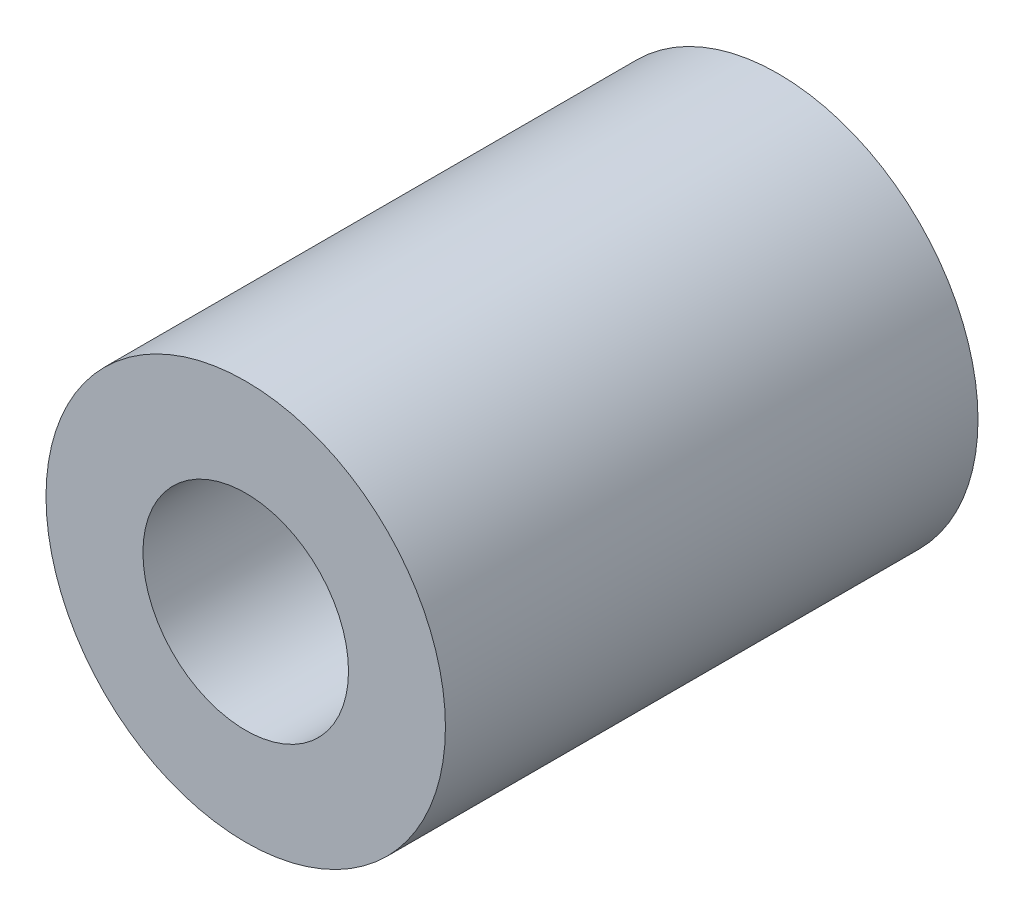
ISO-10303-21;
HEADER;
FILE_DESCRIPTION(('STEP AP214'),'2;1');
FILE_NAME('part.step','',(''),(''),'','','');
FILE_SCHEMA(('AUTOMOTIVE_DESIGN { 1 0 10303 214 1 1 1 1 }'));
ENDSEC;
DATA;
#1=APPLICATION_CONTEXT('core data for automotive mechanical design processes');
#2=APPLICATION_PROTOCOL_DEFINITION('international standard','automotive_design',2000,#1);
#3=PRODUCT_CONTEXT('',#1,'mechanical');
#4=PRODUCT('Part','Part','',(#3));
#5=PRODUCT_RELATED_PRODUCT_CATEGORY('part','',(#4));
#6=PRODUCT_DEFINITION_FORMATION('','',#4);
#7=PRODUCT_DEFINITION_CONTEXT('part definition',#1,'design');
#8=PRODUCT_DEFINITION('design','',#6,#7);
#9=PRODUCT_DEFINITION_SHAPE('','',#8);
#10=(LENGTH_UNIT() NAMED_UNIT(*) SI_UNIT(.MILLI.,.METRE.));
#11=(NAMED_UNIT(*) PLANE_ANGLE_UNIT() SI_UNIT($,.RADIAN.));
#12=(NAMED_UNIT(*) SI_UNIT($,.STERADIAN.) SOLID_ANGLE_UNIT());
#13=UNCERTAINTY_MEASURE_WITH_UNIT(LENGTH_MEASURE(1.E-05),#10,'distance_accuracy_value','');
#14=(GEOMETRIC_REPRESENTATION_CONTEXT(3) GLOBAL_UNCERTAINTY_ASSIGNED_CONTEXT((#13)) GLOBAL_UNIT_ASSIGNED_CONTEXT((#10,
#11,#12)) REPRESENTATION_CONTEXT('',''));
#15=CARTESIAN_POINT('',(0.,0.,0.));
#16=DIRECTION('',(0.,0.,1.));
#17=DIRECTION('',(1.,0.,0.));
#18=AXIS2_PLACEMENT_3D('',#15,#16,#17);
#19=CARTESIAN_POINT('',(0.,0.,12.7));
#20=DIRECTION('',(0.,0.,1.));
#21=DIRECTION('',(1.,0.,0.));
#22=AXIS2_PLACEMENT_3D('',#19,#20,#21);
#23=PLANE('',#22);
#24=CARTESIAN_POINT('',(0.,0.,12.7));
#25=DIRECTION('',(0.,0.,1.));
#26=DIRECTION('',(1.,0.,0.));
#27=AXIS2_PLACEMENT_3D('',#24,#25,#26);
#28=CIRCLE('',#27,4.7625);
#29=CARTESIAN_POINT('',(4.7625,0.,12.7));
#30=VERTEX_POINT('',#29);
#31=EDGE_CURVE('E10',#30,#30,#28,.T.);
#32=ORIENTED_EDGE('',*,*,#31,.T.);
#33=EDGE_LOOP('',(#32));
#34=FACE_BOUND('',#33,.T.);
#35=CARTESIAN_POINT('',(0.,0.,12.7));
#36=DIRECTION('',(0.,0.,1.));
#37=DIRECTION('',(1.,0.,0.));
#38=AXIS2_PLACEMENT_3D('',#35,#36,#37);
#39=CIRCLE('',#38,2.4511);
#40=CARTESIAN_POINT('',(2.4511,0.,12.7));
#41=VERTEX_POINT('',#40);
#42=EDGE_CURVE('E56',#41,#41,#39,.T.);
#43=ORIENTED_EDGE('',*,*,#42,.F.);
#44=EDGE_LOOP('',(#43));
#45=FACE_BOUND('',#44,.T.);
#46=ADVANCED_FACE('F43',(#34,#45),#23,.T.);
#47=CARTESIAN_POINT('',(0.,0.,0.));
#48=DIRECTION('',(0.,0.,1.));
#49=DIRECTION('',(1.,0.,0.));
#50=AXIS2_PLACEMENT_3D('',#47,#48,#49);
#51=PLANE('',#50);
#52=CARTESIAN_POINT('',(0.,0.,0.));
#53=DIRECTION('',(0.,0.,1.));
#54=DIRECTION('',(1.,0.,0.));
#55=AXIS2_PLACEMENT_3D('',#52,#53,#54);
#56=CIRCLE('',#55,4.7625);
#57=CARTESIAN_POINT('',(4.7625,0.,0.));
#58=VERTEX_POINT('',#57);
#59=EDGE_CURVE('E47',#58,#58,#56,.T.);
#60=ORIENTED_EDGE('',*,*,#59,.F.);
#61=EDGE_LOOP('',(#60));
#62=FACE_BOUND('',#61,.T.);
#63=CARTESIAN_POINT('',(0.,0.,0.));
#64=DIRECTION('',(0.,0.,1.));
#65=DIRECTION('',(1.,0.,0.));
#66=AXIS2_PLACEMENT_3D('',#63,#64,#65);
#67=CIRCLE('',#66,2.4511);
#68=CARTESIAN_POINT('',(2.4511,0.,0.));
#69=VERTEX_POINT('',#68);
#70=EDGE_CURVE('E58',#69,#69,#67,.T.);
#71=ORIENTED_EDGE('',*,*,#70,.T.);
#72=EDGE_LOOP('',(#71));
#73=FACE_BOUND('',#72,.T.);
#74=ADVANCED_FACE('F70',(#62,#73),#51,.F.);
#75=CARTESIAN_POINT('',(0.,0.,12.7));
#76=DIRECTION('',(0.,0.,-1.));
#77=DIRECTION('',(-1.,0.,0.));
#78=AXIS2_PLACEMENT_3D('',#75,#76,#77);
#79=CYLINDRICAL_SURFACE('',#78,4.7625);
#80=ORIENTED_EDGE('',*,*,#31,.F.);
#81=EDGE_LOOP('',(#80));
#82=FACE_BOUND('',#81,.T.);
#83=ORIENTED_EDGE('',*,*,#59,.T.);
#84=EDGE_LOOP('',(#83));
#85=FACE_BOUND('',#84,.T.);
#86=ADVANCED_FACE('F45',(#82,#85),#79,.T.);
#87=CARTESIAN_POINT('',(0.,0.,12.7));
#88=DIRECTION('',(0.,0.,-1.));
#89=DIRECTION('',(-1.,0.,0.));
#90=AXIS2_PLACEMENT_3D('',#87,#88,#89);
#91=CYLINDRICAL_SURFACE('',#90,2.4511);
#92=ORIENTED_EDGE('',*,*,#42,.T.);
#93=EDGE_LOOP('',(#92));
#94=FACE_BOUND('',#93,.T.);
#95=ORIENTED_EDGE('',*,*,#70,.F.);
#96=EDGE_LOOP('',(#95));
#97=FACE_BOUND('',#96,.T.);
#98=ADVANCED_FACE('F66',(#94,#97),#91,.F.);
#99=CLOSED_SHELL('',(#46,#74,#86,#98));
#100=MANIFOLD_SOLID_BREP('B2',#99);
#101=ADVANCED_BREP_SHAPE_REPRESENTATION('',(#18,#100),#14);
#102=SHAPE_DEFINITION_REPRESENTATION(#9,#101);
ENDSEC;
END-ISO-10303-21;
